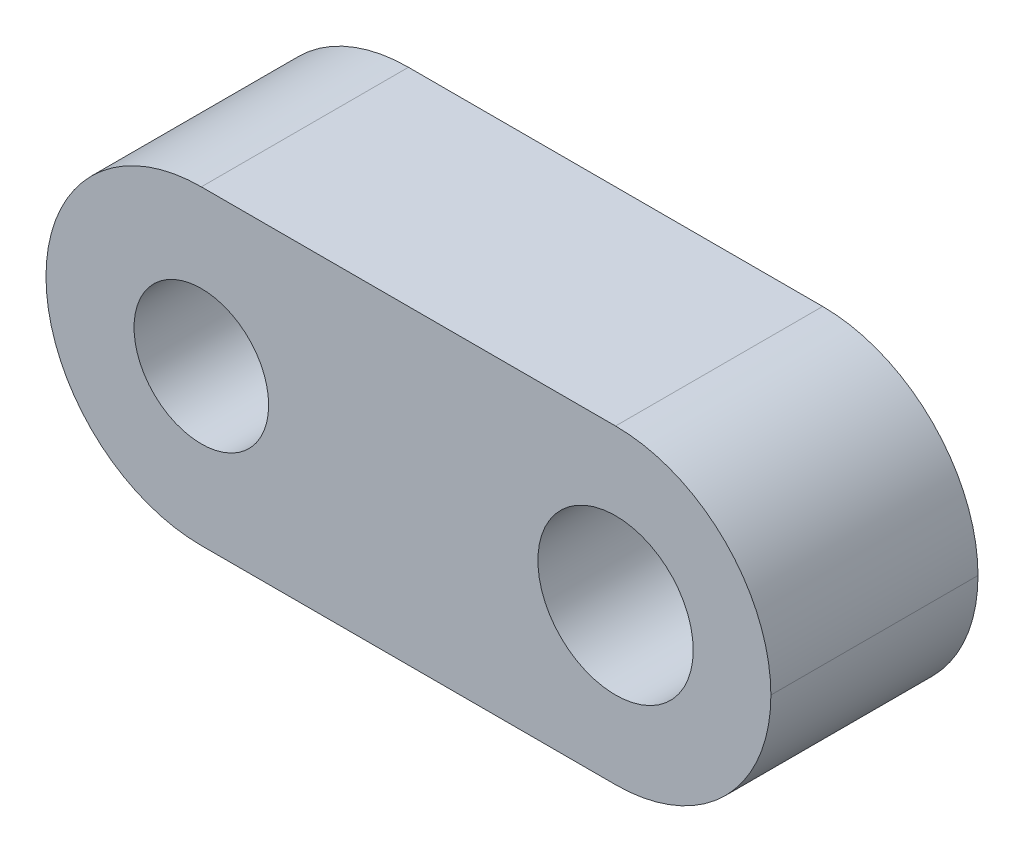
ISO-10303-21;
HEADER;
FILE_DESCRIPTION(('STEP AP214'),'2;1');
FILE_NAME('part.step','',(''),(''),'','','');
FILE_SCHEMA(('AUTOMOTIVE_DESIGN { 1 0 10303 214 1 1 1 1 }'));
ENDSEC;
DATA;
#1=APPLICATION_CONTEXT('core data for automotive mechanical design processes');
#2=APPLICATION_PROTOCOL_DEFINITION('international standard','automotive_design',2000,#1);
#3=PRODUCT_CONTEXT('',#1,'mechanical');
#4=PRODUCT('Part','Part','',(#3));
#5=PRODUCT_RELATED_PRODUCT_CATEGORY('part','',(#4));
#6=PRODUCT_DEFINITION_FORMATION('','',#4);
#7=PRODUCT_DEFINITION_CONTEXT('part definition',#1,'design');
#8=PRODUCT_DEFINITION('design','',#6,#7);
#9=PRODUCT_DEFINITION_SHAPE('','',#8);
#10=(LENGTH_UNIT() NAMED_UNIT(*) SI_UNIT(.MILLI.,.METRE.));
#11=(NAMED_UNIT(*) PLANE_ANGLE_UNIT() SI_UNIT($,.RADIAN.));
#12=(NAMED_UNIT(*) SI_UNIT($,.STERADIAN.) SOLID_ANGLE_UNIT());
#13=UNCERTAINTY_MEASURE_WITH_UNIT(LENGTH_MEASURE(1.E-05),#10,'distance_accuracy_value','');
#14=(GEOMETRIC_REPRESENTATION_CONTEXT(3) GLOBAL_UNCERTAINTY_ASSIGNED_CONTEXT((#13)) GLOBAL_UNIT_ASSIGNED_CONTEXT((#10,
#11,#12)) REPRESENTATION_CONTEXT('',''));
#15=CARTESIAN_POINT('',(0.,0.,0.));
#16=DIRECTION('',(0.,0.,1.));
#17=DIRECTION('',(1.,0.,0.));
#18=AXIS2_PLACEMENT_3D('',#15,#16,#17);
#19=CARTESIAN_POINT('',(0.,-6.,4.));
#20=DIRECTION('',(0.,1.,0.));
#21=DIRECTION('',(0.,0.,1.));
#22=AXIS2_PLACEMENT_3D('',#19,#20,#21);
#23=PLANE('',#22);
#24=DIRECTION('',(1.,0.,0.));
#25=VECTOR('',#24,1.);
#26=CARTESIAN_POINT('',(0.,-6.,0.));
#27=LINE('',#26,#25);
#28=CARTESIAN_POINT('',(3.,-6.,0.));
#29=VERTEX_POINT('',#28);
#30=CARTESIAN_POINT('',(11.,-6.,0.));
#31=VERTEX_POINT('',#30);
#32=EDGE_CURVE('E92',#29,#31,#27,.T.);
#33=ORIENTED_EDGE('',*,*,#32,.T.);
#34=DIRECTION('',(0.,0.,-1.));
#35=VECTOR('',#34,1.);
#36=CARTESIAN_POINT('',(11.,-6.,4.));
#37=LINE('',#36,#35);
#38=CARTESIAN_POINT('',(11.,-6.,4.));
#39=VERTEX_POINT('',#38);
#40=EDGE_CURVE('E124',#31,#39,#37,.F.);
#41=ORIENTED_EDGE('',*,*,#40,.T.);
#42=DIRECTION('',(1.,0.,0.));
#43=VECTOR('',#42,1.);
#44=CARTESIAN_POINT('',(0.,-6.,4.));
#45=LINE('',#44,#43);
#46=CARTESIAN_POINT('',(3.,-6.,4.));
#47=VERTEX_POINT('',#46);
#48=EDGE_CURVE('E134',#47,#39,#45,.T.);
#49=ORIENTED_EDGE('',*,*,#48,.F.);
#50=DIRECTION('',(0.,0.,-1.));
#51=VECTOR('',#50,1.);
#52=CARTESIAN_POINT('',(3.,-6.,4.));
#53=LINE('',#52,#51);
#54=EDGE_CURVE('E127',#47,#29,#53,.T.);
#55=ORIENTED_EDGE('',*,*,#54,.T.);
#56=EDGE_LOOP('',(#33,#41,#49,#55));
#57=FACE_BOUND('',#56,.T.);
#58=ADVANCED_FACE('F33',(#57),#23,.F.);
#59=CARTESIAN_POINT('',(0.,0.,4.));
#60=DIRECTION('',(0.,-1.,0.));
#61=DIRECTION('',(0.,0.,-1.));
#62=AXIS2_PLACEMENT_3D('',#59,#60,#61);
#63=PLANE('',#62);
#64=DIRECTION('',(-1.,0.,0.));
#65=VECTOR('',#64,1.);
#66=CARTESIAN_POINT('',(0.,0.,4.));
#67=LINE('',#66,#65);
#68=CARTESIAN_POINT('',(11.,0.,4.));
#69=VERTEX_POINT('',#68);
#70=CARTESIAN_POINT('',(3.,0.,4.));
#71=VERTEX_POINT('',#70);
#72=EDGE_CURVE('E103',#69,#71,#67,.T.);
#73=ORIENTED_EDGE('',*,*,#72,.F.);
#74=DIRECTION('',(0.,0.,-1.));
#75=VECTOR('',#74,1.);
#76=CARTESIAN_POINT('',(11.,0.,4.));
#77=LINE('',#76,#75);
#78=CARTESIAN_POINT('',(11.,0.,0.));
#79=VERTEX_POINT('',#78);
#80=EDGE_CURVE('E11',#69,#79,#77,.T.);
#81=ORIENTED_EDGE('',*,*,#80,.T.);
#82=DIRECTION('',(-1.,0.,0.));
#83=VECTOR('',#82,1.);
#84=CARTESIAN_POINT('',(0.,0.,0.));
#85=LINE('',#84,#83);
#86=CARTESIAN_POINT('',(3.,0.,0.));
#87=VERTEX_POINT('',#86);
#88=EDGE_CURVE('E132',#79,#87,#85,.T.);
#89=ORIENTED_EDGE('',*,*,#88,.T.);
#90=DIRECTION('',(0.,0.,-1.));
#91=VECTOR('',#90,1.);
#92=CARTESIAN_POINT('',(3.,0.,4.));
#93=LINE('',#92,#91);
#94=EDGE_CURVE('E42',#87,#71,#93,.F.);
#95=ORIENTED_EDGE('',*,*,#94,.T.);
#96=EDGE_LOOP('',(#73,#81,#89,#95));
#97=FACE_BOUND('',#96,.T.);
#98=ADVANCED_FACE('F154',(#97),#63,.F.);
#99=CARTESIAN_POINT('',(0.,0.,4.));
#100=DIRECTION('',(0.,0.,1.));
#101=DIRECTION('',(1.,0.,0.));
#102=AXIS2_PLACEMENT_3D('',#99,#100,#101);
#103=PLANE('',#102);
#104=CARTESIAN_POINT('',(11.,-3.,4.));
#105=DIRECTION('',(0.,0.,1.));
#106=DIRECTION('',(1.,0.,0.));
#107=AXIS2_PLACEMENT_3D('',#104,#105,#106);
#108=CIRCLE('',#107,1.5);
#109=CARTESIAN_POINT('',(12.5,-3.,4.));
#110=VERTEX_POINT('',#109);
#111=EDGE_CURVE('E114',#110,#110,#108,.T.);
#112=ORIENTED_EDGE('',*,*,#111,.F.);
#113=EDGE_LOOP('',(#112));
#114=FACE_BOUND('',#113,.T.);
#115=CARTESIAN_POINT('',(3.,-3.,4.));
#116=DIRECTION('',(0.,0.,1.));
#117=DIRECTION('',(1.,0.,0.));
#118=AXIS2_PLACEMENT_3D('',#115,#116,#117);
#119=CIRCLE('',#118,1.3);
#120=CARTESIAN_POINT('',(4.3,-3.,4.));
#121=VERTEX_POINT('',#120);
#122=EDGE_CURVE('E136',#121,#121,#119,.T.);
#123=ORIENTED_EDGE('',*,*,#122,.F.);
#124=EDGE_LOOP('',(#123));
#125=FACE_BOUND('',#124,.T.);
#126=ORIENTED_EDGE('',*,*,#48,.T.);
#127=CARTESIAN_POINT('',(11.,-3.,4.));
#128=DIRECTION('',(0.,0.,1.));
#129=DIRECTION('',(1.,0.,0.));
#130=AXIS2_PLACEMENT_3D('',#127,#128,#129);
#131=CIRCLE('',#130,3.);
#132=CARTESIAN_POINT('',(14.,-3.,4.));
#133=VERTEX_POINT('',#132);
#134=EDGE_CURVE('E118',#39,#133,#131,.T.);
#135=ORIENTED_EDGE('',*,*,#134,.T.);
#136=CARTESIAN_POINT('',(11.,-3.,4.));
#137=DIRECTION('',(0.,0.,1.));
#138=DIRECTION('',(1.,0.,0.));
#139=AXIS2_PLACEMENT_3D('',#136,#137,#138);
#140=CIRCLE('',#139,3.);
#141=EDGE_CURVE('E56',#133,#69,#140,.T.);
#142=ORIENTED_EDGE('',*,*,#141,.T.);
#143=ORIENTED_EDGE('',*,*,#72,.T.);
#144=CARTESIAN_POINT('',(3.,-3.,4.));
#145=DIRECTION('',(0.,0.,1.));
#146=DIRECTION('',(1.,0.,0.));
#147=AXIS2_PLACEMENT_3D('',#144,#145,#146);
#148=CIRCLE('',#147,3.);
#149=CARTESIAN_POINT('',(0.,-3.,4.));
#150=VERTEX_POINT('',#149);
#151=EDGE_CURVE('E122',#71,#150,#148,.T.);
#152=ORIENTED_EDGE('',*,*,#151,.T.);
#153=CARTESIAN_POINT('',(3.,-3.,4.));
#154=DIRECTION('',(0.,0.,1.));
#155=DIRECTION('',(1.,0.,0.));
#156=AXIS2_PLACEMENT_3D('',#153,#154,#155);
#157=CIRCLE('',#156,3.);
#158=EDGE_CURVE('E106',#150,#47,#157,.T.);
#159=ORIENTED_EDGE('',*,*,#158,.T.);
#160=EDGE_LOOP('',(#126,#135,#142,#143,#152,#159));
#161=FACE_BOUND('',#160,.T.);
#162=ADVANCED_FACE('F151',(#114,#125,#161),#103,.T.);
#163=CARTESIAN_POINT('',(0.,0.,0.));
#164=DIRECTION('',(0.,0.,1.));
#165=DIRECTION('',(1.,0.,0.));
#166=AXIS2_PLACEMENT_3D('',#163,#164,#165);
#167=PLANE('',#166);
#168=CARTESIAN_POINT('',(11.,-3.,0.));
#169=DIRECTION('',(0.,0.,1.));
#170=DIRECTION('',(1.,0.,0.));
#171=AXIS2_PLACEMENT_3D('',#168,#169,#170);
#172=CIRCLE('',#171,1.5);
#173=CARTESIAN_POINT('',(12.5,-3.,0.));
#174=VERTEX_POINT('',#173);
#175=EDGE_CURVE('E109',#174,#174,#172,.T.);
#176=ORIENTED_EDGE('',*,*,#175,.T.);
#177=EDGE_LOOP('',(#176));
#178=FACE_BOUND('',#177,.T.);
#179=CARTESIAN_POINT('',(3.,-3.,0.));
#180=DIRECTION('',(0.,0.,1.));
#181=DIRECTION('',(1.,0.,0.));
#182=AXIS2_PLACEMENT_3D('',#179,#180,#181);
#183=CIRCLE('',#182,1.3);
#184=CARTESIAN_POINT('',(4.3,-3.,0.));
#185=VERTEX_POINT('',#184);
#186=EDGE_CURVE('E142',#185,#185,#183,.T.);
#187=ORIENTED_EDGE('',*,*,#186,.T.);
#188=EDGE_LOOP('',(#187));
#189=FACE_BOUND('',#188,.T.);
#190=CARTESIAN_POINT('',(11.,-3.,0.));
#191=DIRECTION('',(0.,0.,1.));
#192=DIRECTION('',(1.,0.,0.));
#193=AXIS2_PLACEMENT_3D('',#190,#191,#192);
#194=CIRCLE('',#193,3.);
#195=CARTESIAN_POINT('',(14.,-3.,0.));
#196=VERTEX_POINT('',#195);
#197=EDGE_CURVE('E97',#79,#196,#194,.F.);
#198=ORIENTED_EDGE('',*,*,#197,.T.);
#199=CARTESIAN_POINT('',(11.,-3.,0.));
#200=DIRECTION('',(0.,0.,1.));
#201=DIRECTION('',(1.,0.,0.));
#202=AXIS2_PLACEMENT_3D('',#199,#200,#201);
#203=CIRCLE('',#202,3.);
#204=EDGE_CURVE('E129',#196,#31,#203,.F.);
#205=ORIENTED_EDGE('',*,*,#204,.T.);
#206=ORIENTED_EDGE('',*,*,#32,.F.);
#207=CARTESIAN_POINT('',(3.,-3.,0.));
#208=DIRECTION('',(0.,0.,1.));
#209=DIRECTION('',(1.,0.,0.));
#210=AXIS2_PLACEMENT_3D('',#207,#208,#209);
#211=CIRCLE('',#210,3.);
#212=CARTESIAN_POINT('',(0.,-3.,0.));
#213=VERTEX_POINT('',#212);
#214=EDGE_CURVE('E86',#29,#213,#211,.F.);
#215=ORIENTED_EDGE('',*,*,#214,.T.);
#216=CARTESIAN_POINT('',(3.,-3.,0.));
#217=DIRECTION('',(0.,0.,1.));
#218=DIRECTION('',(1.,0.,0.));
#219=AXIS2_PLACEMENT_3D('',#216,#217,#218);
#220=CIRCLE('',#219,3.);
#221=EDGE_CURVE('E90',#213,#87,#220,.F.);
#222=ORIENTED_EDGE('',*,*,#221,.T.);
#223=ORIENTED_EDGE('',*,*,#88,.F.);
#224=EDGE_LOOP('',(#198,#205,#206,#215,#222,#223));
#225=FACE_BOUND('',#224,.T.);
#226=ADVANCED_FACE('F88',(#178,#189,#225),#167,.F.);
#227=CARTESIAN_POINT('',(3.,-3.,0.));
#228=DIRECTION('',(0.,0.,1.));
#229=DIRECTION('',(1.,0.,0.));
#230=AXIS2_PLACEMENT_3D('',#227,#228,#229);
#231=CYLINDRICAL_SURFACE('',#230,1.3);
#232=ORIENTED_EDGE('',*,*,#122,.T.);
#233=EDGE_LOOP('',(#232));
#234=FACE_BOUND('',#233,.T.);
#235=ORIENTED_EDGE('',*,*,#186,.F.);
#236=EDGE_LOOP('',(#235));
#237=FACE_BOUND('',#236,.T.);
#238=ADVANCED_FACE('F197',(#234,#237),#231,.F.);
#239=CARTESIAN_POINT('',(11.,-3.,0.));
#240=DIRECTION('',(0.,0.,1.));
#241=DIRECTION('',(1.,0.,0.));
#242=AXIS2_PLACEMENT_3D('',#239,#240,#241);
#243=CYLINDRICAL_SURFACE('',#242,1.5);
#244=ORIENTED_EDGE('',*,*,#111,.T.);
#245=EDGE_LOOP('',(#244));
#246=FACE_BOUND('',#245,.T.);
#247=ORIENTED_EDGE('',*,*,#175,.F.);
#248=EDGE_LOOP('',(#247));
#249=FACE_BOUND('',#248,.T.);
#250=ADVANCED_FACE('F148',(#246,#249),#243,.F.);
#251=CARTESIAN_POINT('',(11.,-3.,4.));
#252=DIRECTION('',(0.,0.,-1.));
#253=DIRECTION('',(-1.,0.,0.));
#254=AXIS2_PLACEMENT_3D('',#251,#252,#253);
#255=CYLINDRICAL_SURFACE('',#254,3.);
#256=ORIENTED_EDGE('',*,*,#80,.F.);
#257=ORIENTED_EDGE('',*,*,#141,.F.);
#258=DIRECTION('',(0.,0.,-1.));
#259=VECTOR('',#258,1.);
#260=CARTESIAN_POINT('',(14.,-3.,4.));
#261=LINE('',#260,#259);
#262=EDGE_CURVE('E107',#196,#133,#261,.F.);
#263=ORIENTED_EDGE('',*,*,#262,.F.);
#264=ORIENTED_EDGE('',*,*,#197,.F.);
#265=EDGE_LOOP('',(#256,#257,#263,#264));
#266=FACE_BOUND('',#265,.T.);
#267=ADVANCED_FACE('F164',(#266),#255,.T.);
#268=CARTESIAN_POINT('',(11.,-3.,4.));
#269=DIRECTION('',(0.,0.,-1.));
#270=DIRECTION('',(-1.,0.,0.));
#271=AXIS2_PLACEMENT_3D('',#268,#269,#270);
#272=CYLINDRICAL_SURFACE('',#271,3.);
#273=ORIENTED_EDGE('',*,*,#134,.F.);
#274=ORIENTED_EDGE('',*,*,#40,.F.);
#275=ORIENTED_EDGE('',*,*,#204,.F.);
#276=ORIENTED_EDGE('',*,*,#262,.T.);
#277=EDGE_LOOP('',(#273,#274,#275,#276));
#278=FACE_BOUND('',#277,.T.);
#279=ADVANCED_FACE('F160',(#278),#272,.T.);
#280=CARTESIAN_POINT('',(3.,-3.,4.));
#281=DIRECTION('',(0.,0.,-1.));
#282=DIRECTION('',(-1.,0.,0.));
#283=AXIS2_PLACEMENT_3D('',#280,#281,#282);
#284=CYLINDRICAL_SURFACE('',#283,3.);
#285=DIRECTION('',(0.,0.,-1.));
#286=VECTOR('',#285,1.);
#287=CARTESIAN_POINT('',(0.,-3.,4.));
#288=LINE('',#287,#286);
#289=EDGE_CURVE('E37',#150,#213,#288,.T.);
#290=ORIENTED_EDGE('',*,*,#289,.F.);
#291=ORIENTED_EDGE('',*,*,#151,.F.);
#292=ORIENTED_EDGE('',*,*,#94,.F.);
#293=ORIENTED_EDGE('',*,*,#221,.F.);
#294=EDGE_LOOP('',(#290,#291,#292,#293));
#295=FACE_BOUND('',#294,.T.);
#296=ADVANCED_FACE('F35',(#295),#284,.T.);
#297=CARTESIAN_POINT('',(3.,-3.,4.));
#298=DIRECTION('',(0.,0.,-1.));
#299=DIRECTION('',(-1.,0.,0.));
#300=AXIS2_PLACEMENT_3D('',#297,#298,#299);
#301=CYLINDRICAL_SURFACE('',#300,3.);
#302=ORIENTED_EDGE('',*,*,#158,.F.);
#303=ORIENTED_EDGE('',*,*,#289,.T.);
#304=ORIENTED_EDGE('',*,*,#214,.F.);
#305=ORIENTED_EDGE('',*,*,#54,.F.);
#306=EDGE_LOOP('',(#302,#303,#304,#305));
#307=FACE_BOUND('',#306,.T.);
#308=ADVANCED_FACE('F105',(#307),#301,.T.);
#309=CLOSED_SHELL('',(#58,#98,#162,#226,#238,#250,#267,#279,#296,#308));
#310=MANIFOLD_SOLID_BREP('B2',#309);
#311=ADVANCED_BREP_SHAPE_REPRESENTATION('',(#18,#310),#14);
#312=SHAPE_DEFINITION_REPRESENTATION(#9,#311);
ENDSEC;
END-ISO-10303-21;
